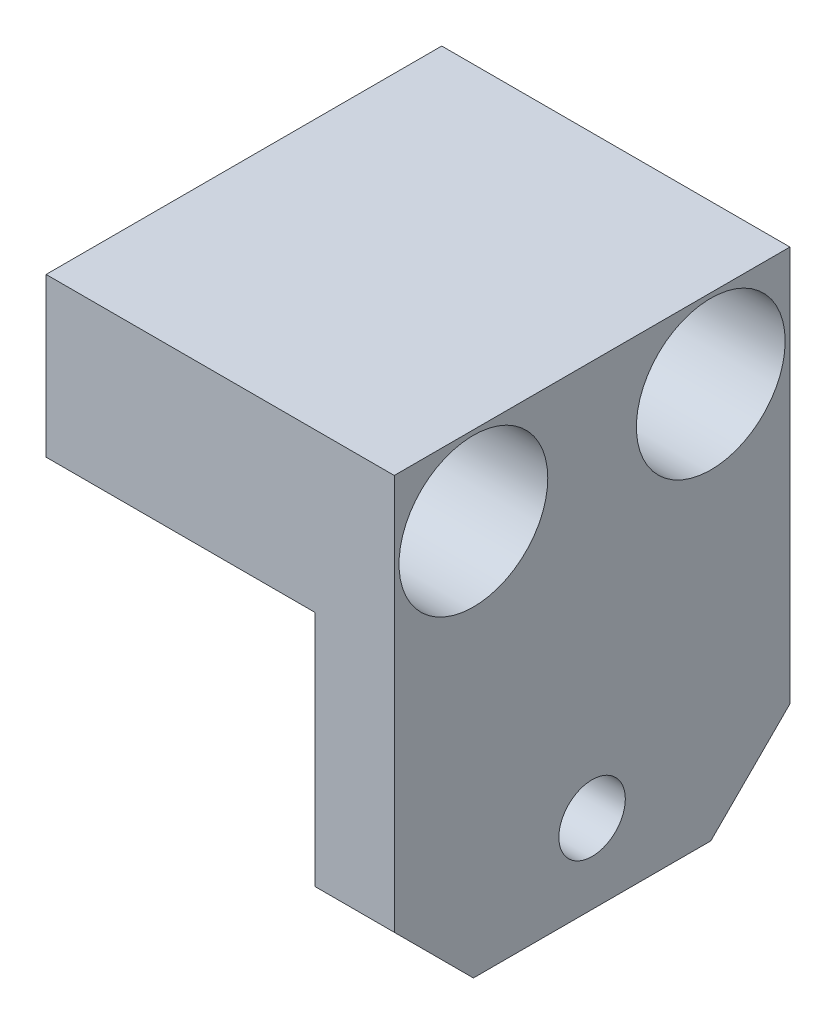
ISO-10303-21;
HEADER;
FILE_DESCRIPTION(('STEP AP214'),'2;1');
FILE_NAME('part.step','',(''),(''),'','','');
FILE_SCHEMA(('AUTOMOTIVE_DESIGN { 1 0 10303 214 1 1 1 1 }'));
ENDSEC;
DATA;
#1=APPLICATION_CONTEXT('core data for automotive mechanical design processes');
#2=APPLICATION_PROTOCOL_DEFINITION('international standard','automotive_design',2000,#1);
#3=PRODUCT_CONTEXT('',#1,'mechanical');
#4=PRODUCT('Part','Part','',(#3));
#5=PRODUCT_RELATED_PRODUCT_CATEGORY('part','',(#4));
#6=PRODUCT_DEFINITION_FORMATION('','',#4);
#7=PRODUCT_DEFINITION_CONTEXT('part definition',#1,'design');
#8=PRODUCT_DEFINITION('design','',#6,#7);
#9=PRODUCT_DEFINITION_SHAPE('','',#8);
#10=(LENGTH_UNIT() NAMED_UNIT(*) SI_UNIT(.MILLI.,.METRE.));
#11=(NAMED_UNIT(*) PLANE_ANGLE_UNIT() SI_UNIT($,.RADIAN.));
#12=(NAMED_UNIT(*) SI_UNIT($,.STERADIAN.) SOLID_ANGLE_UNIT());
#13=UNCERTAINTY_MEASURE_WITH_UNIT(LENGTH_MEASURE(1.E-05),#10,'distance_accuracy_value','');
#14=(GEOMETRIC_REPRESENTATION_CONTEXT(3) GLOBAL_UNCERTAINTY_ASSIGNED_CONTEXT((#13)) GLOBAL_UNIT_ASSIGNED_CONTEXT((#10,
#11,#12)) REPRESENTATION_CONTEXT('',''));
#15=CARTESIAN_POINT('',(0.,0.,0.));
#16=DIRECTION('',(0.,0.,1.));
#17=DIRECTION('',(1.,0.,0.));
#18=AXIS2_PLACEMENT_3D('',#15,#16,#17);
#19=CARTESIAN_POINT('',(11.,-15.,12.5));
#20=DIRECTION('',(-1.,0.,0.));
#21=DIRECTION('',(0.,0.,1.));
#22=AXIS2_PLACEMENT_3D('',#19,#20,#21);
#23=PLANE('',#22);
#24=CARTESIAN_POINT('',(11.,-10.,0.));
#25=DIRECTION('',(1.,0.,0.));
#26=DIRECTION('',(0.,0.,-1.));
#27=AXIS2_PLACEMENT_3D('',#24,#25,#26);
#28=CIRCLE('',#27,2.09999999999999);
#29=CARTESIAN_POINT('',(11.,-10.,-2.09999999999999));
#30=VERTEX_POINT('',#29);
#31=EDGE_CURVE('E151',#30,#30,#28,.T.);
#32=ORIENTED_EDGE('',*,*,#31,.F.);
#33=EDGE_LOOP('',(#32));
#34=FACE_BOUND('',#33,.T.);
#35=CARTESIAN_POINT('',(11.,9.99999999999999,-7.5));
#36=DIRECTION('',(1.,0.,0.));
#37=DIRECTION('',(0.,0.,-1.));
#38=AXIS2_PLACEMENT_3D('',#35,#36,#37);
#39=CIRCLE('',#38,4.7);
#40=CARTESIAN_POINT('',(11.,9.99999999999999,-12.2));
#41=VERTEX_POINT('',#40);
#42=EDGE_CURVE('E150',#41,#41,#39,.T.);
#43=ORIENTED_EDGE('',*,*,#42,.F.);
#44=EDGE_LOOP('',(#43));
#45=FACE_BOUND('',#44,.T.);
#46=CARTESIAN_POINT('',(11.,9.99999999999999,7.5));
#47=DIRECTION('',(1.,0.,0.));
#48=DIRECTION('',(0.,0.,-1.));
#49=AXIS2_PLACEMENT_3D('',#46,#47,#48);
#50=CIRCLE('',#49,4.7);
#51=CARTESIAN_POINT('',(11.,9.99999999999999,2.8));
#52=VERTEX_POINT('',#51);
#53=EDGE_CURVE('E191',#52,#52,#50,.T.);
#54=ORIENTED_EDGE('',*,*,#53,.F.);
#55=EDGE_LOOP('',(#54));
#56=FACE_BOUND('',#55,.T.);
#57=DIRECTION('',(0.,0.,-1.));
#58=VECTOR('',#57,1.);
#59=CARTESIAN_POINT('',(11.,-15.,12.5));
#60=LINE('',#59,#58);
#61=CARTESIAN_POINT('',(11.,-15.,7.49999999999999));
#62=VERTEX_POINT('',#61);
#63=CARTESIAN_POINT('',(11.,-15.,-7.5));
#64=VERTEX_POINT('',#63);
#65=EDGE_CURVE('E138',#62,#64,#60,.T.);
#66=ORIENTED_EDGE('',*,*,#65,.T.);
#67=DIRECTION('',(0.,0.707106781186549,-0.707106781186547));
#68=VECTOR('',#67,1.);
#69=CARTESIAN_POINT('',(11.,-15.,-7.5));
#70=LINE('',#69,#68);
#71=CARTESIAN_POINT('',(11.,-9.99999999999999,-12.5));
#72=VERTEX_POINT('',#71);
#73=EDGE_CURVE('E158',#64,#72,#70,.T.);
#74=ORIENTED_EDGE('',*,*,#73,.T.);
#75=DIRECTION('',(0.,1.,0.));
#76=VECTOR('',#75,1.);
#77=CARTESIAN_POINT('',(11.,-15.,-12.5));
#78=LINE('',#77,#76);
#79=CARTESIAN_POINT('',(11.,15.,-12.5));
#80=VERTEX_POINT('',#79);
#81=EDGE_CURVE('E116',#72,#80,#78,.T.);
#82=ORIENTED_EDGE('',*,*,#81,.T.);
#83=DIRECTION('',(0.,0.,-1.));
#84=VECTOR('',#83,1.);
#85=CARTESIAN_POINT('',(11.,15.,12.5));
#86=LINE('',#85,#84);
#87=CARTESIAN_POINT('',(11.,15.,12.5));
#88=VERTEX_POINT('',#87);
#89=EDGE_CURVE('E143',#88,#80,#86,.T.);
#90=ORIENTED_EDGE('',*,*,#89,.F.);
#91=DIRECTION('',(0.,1.,0.));
#92=VECTOR('',#91,1.);
#93=CARTESIAN_POINT('',(11.,-15.,12.5));
#94=LINE('',#93,#92);
#95=CARTESIAN_POINT('',(11.,-10.,12.5));
#96=VERTEX_POINT('',#95);
#97=EDGE_CURVE('E130',#96,#88,#94,.T.);
#98=ORIENTED_EDGE('',*,*,#97,.F.);
#99=DIRECTION('',(0.,0.707106781186547,0.707106781186549));
#100=VECTOR('',#99,1.);
#101=CARTESIAN_POINT('',(11.,-10.,12.5));
#102=LINE('',#101,#100);
#103=EDGE_CURVE('E156',#96,#62,#102,.F.);
#104=ORIENTED_EDGE('',*,*,#103,.T.);
#105=EDGE_LOOP('',(#66,#74,#82,#90,#98,#104));
#106=FACE_BOUND('',#105,.T.);
#107=ADVANCED_FACE('F37',(#34,#45,#56,#106),#23,.F.);
#108=CARTESIAN_POINT('',(-11.,15.,12.5));
#109=DIRECTION('',(0.,-1.,0.));
#110=DIRECTION('',(0.,0.,-1.));
#111=AXIS2_PLACEMENT_3D('',#108,#109,#110);
#112=PLANE('',#111);
#113=DIRECTION('',(-1.,0.,0.));
#114=VECTOR('',#113,1.);
#115=CARTESIAN_POINT('',(-11.,15.,-12.5));
#116=LINE('',#115,#114);
#117=CARTESIAN_POINT('',(-11.,15.,-12.5));
#118=VERTEX_POINT('',#117);
#119=EDGE_CURVE('E131',#80,#118,#116,.T.);
#120=ORIENTED_EDGE('',*,*,#119,.T.);
#121=DIRECTION('',(0.,0.,-1.));
#122=VECTOR('',#121,1.);
#123=CARTESIAN_POINT('',(-11.,15.,12.5));
#124=LINE('',#123,#122);
#125=CARTESIAN_POINT('',(-11.,15.,12.5));
#126=VERTEX_POINT('',#125);
#127=EDGE_CURVE('E129',#126,#118,#124,.T.);
#128=ORIENTED_EDGE('',*,*,#127,.F.);
#129=DIRECTION('',(-1.,0.,0.));
#130=VECTOR('',#129,1.);
#131=CARTESIAN_POINT('',(-11.,15.,12.5));
#132=LINE('',#131,#130);
#133=EDGE_CURVE('E133',#88,#126,#132,.T.);
#134=ORIENTED_EDGE('',*,*,#133,.F.);
#135=ORIENTED_EDGE('',*,*,#89,.T.);
#136=EDGE_LOOP('',(#120,#128,#134,#135));
#137=FACE_BOUND('',#136,.T.);
#138=ADVANCED_FACE('F213',(#137),#112,.F.);
#139=CARTESIAN_POINT('',(-11.,-15.,12.5));
#140=DIRECTION('',(1.,0.,0.));
#141=DIRECTION('',(0.,0.,-1.));
#142=AXIS2_PLACEMENT_3D('',#139,#140,#141);
#143=PLANE('',#142);
#144=CARTESIAN_POINT('',(-11.,9.99999999999999,-7.5));
#145=DIRECTION('',(1.,0.,0.));
#146=DIRECTION('',(0.,0.,-1.));
#147=AXIS2_PLACEMENT_3D('',#144,#145,#146);
#148=CIRCLE('',#147,2.74999999999999);
#149=CARTESIAN_POINT('',(-11.,9.99999999999999,-10.25));
#150=VERTEX_POINT('',#149);
#151=EDGE_CURVE('E194',#150,#150,#148,.T.);
#152=ORIENTED_EDGE('',*,*,#151,.T.);
#153=EDGE_LOOP('',(#152));
#154=FACE_BOUND('',#153,.T.);
#155=CARTESIAN_POINT('',(-11.,9.99999999999999,7.5));
#156=DIRECTION('',(1.,0.,0.));
#157=DIRECTION('',(0.,0.,-1.));
#158=AXIS2_PLACEMENT_3D('',#155,#156,#157);
#159=CIRCLE('',#158,2.74999999999999);
#160=CARTESIAN_POINT('',(-11.,9.99999999999999,4.75000000000001));
#161=VERTEX_POINT('',#160);
#162=EDGE_CURVE('E180',#161,#161,#159,.T.);
#163=ORIENTED_EDGE('',*,*,#162,.T.);
#164=EDGE_LOOP('',(#163));
#165=FACE_BOUND('',#164,.T.);
#166=DIRECTION('',(0.,-1.,0.));
#167=VECTOR('',#166,1.);
#168=CARTESIAN_POINT('',(-11.,-15.,-12.5));
#169=LINE('',#168,#167);
#170=CARTESIAN_POINT('',(-11.,5.,-12.5));
#171=VERTEX_POINT('',#170);
#172=EDGE_CURVE('E122',#118,#171,#169,.T.);
#173=ORIENTED_EDGE('',*,*,#172,.T.);
#174=DIRECTION('',(0.,0.,1.));
#175=VECTOR('',#174,1.);
#176=CARTESIAN_POINT('',(-11.,5.,-12.5));
#177=LINE('',#176,#175);
#178=CARTESIAN_POINT('',(-11.,5.,12.5));
#179=VERTEX_POINT('',#178);
#180=EDGE_CURVE('E104',#171,#179,#177,.T.);
#181=ORIENTED_EDGE('',*,*,#180,.T.);
#182=DIRECTION('',(0.,-1.,0.));
#183=VECTOR('',#182,1.);
#184=CARTESIAN_POINT('',(-11.,-15.,12.5));
#185=LINE('',#184,#183);
#186=EDGE_CURVE('E141',#126,#179,#185,.T.);
#187=ORIENTED_EDGE('',*,*,#186,.F.);
#188=ORIENTED_EDGE('',*,*,#127,.T.);
#189=EDGE_LOOP('',(#173,#181,#187,#188));
#190=FACE_BOUND('',#189,.T.);
#191=ADVANCED_FACE('F127',(#154,#165,#190),#143,.F.);
#192=CARTESIAN_POINT('',(-11.,-15.,12.5));
#193=DIRECTION('',(0.,1.,0.));
#194=DIRECTION('',(0.,0.,1.));
#195=AXIS2_PLACEMENT_3D('',#192,#193,#194);
#196=PLANE('',#195);
#197=DIRECTION('',(0.,0.,1.));
#198=VECTOR('',#197,1.);
#199=CARTESIAN_POINT('',(6.,-15.,-12.5));
#200=LINE('',#199,#198);
#201=CARTESIAN_POINT('',(6.,-15.,-7.50000000000001));
#202=VERTEX_POINT('',#201);
#203=CARTESIAN_POINT('',(6.,-15.,7.49999999999998));
#204=VERTEX_POINT('',#203);
#205=EDGE_CURVE('E124',#202,#204,#200,.T.);
#206=ORIENTED_EDGE('',*,*,#205,.F.);
#207=DIRECTION('',(1.,0.,0.));
#208=VECTOR('',#207,1.);
#209=CARTESIAN_POINT('',(11.,-15.,-7.5));
#210=LINE('',#209,#208);
#211=EDGE_CURVE('E153',#202,#64,#210,.T.);
#212=ORIENTED_EDGE('',*,*,#211,.T.);
#213=ORIENTED_EDGE('',*,*,#65,.F.);
#214=DIRECTION('',(-1.,0.,0.));
#215=VECTOR('',#214,1.);
#216=CARTESIAN_POINT('',(-11.,-15.,7.49999999999999));
#217=LINE('',#216,#215);
#218=EDGE_CURVE('E146',#62,#204,#217,.T.);
#219=ORIENTED_EDGE('',*,*,#218,.T.);
#220=EDGE_LOOP('',(#206,#212,#213,#219));
#221=FACE_BOUND('',#220,.T.);
#222=ADVANCED_FACE('F167',(#221),#196,.F.);
#223=CARTESIAN_POINT('',(0.,0.,12.5));
#224=DIRECTION('',(0.,0.,-1.));
#225=DIRECTION('',(-1.,0.,0.));
#226=AXIS2_PLACEMENT_3D('',#223,#224,#225);
#227=PLANE('',#226);
#228=DIRECTION('',(0.,1.,0.));
#229=VECTOR('',#228,1.);
#230=CARTESIAN_POINT('',(6.,-15.,12.5));
#231=LINE('',#230,#229);
#232=CARTESIAN_POINT('',(6.,-10.,12.5));
#233=VERTEX_POINT('',#232);
#234=CARTESIAN_POINT('',(6.,4.99999999999999,12.5));
#235=VERTEX_POINT('',#234);
#236=EDGE_CURVE('E179',#233,#235,#231,.T.);
#237=ORIENTED_EDGE('',*,*,#236,.F.);
#238=DIRECTION('',(1.,0.,0.));
#239=VECTOR('',#238,1.);
#240=CARTESIAN_POINT('',(0.,-10.,12.5));
#241=LINE('',#240,#239);
#242=EDGE_CURVE('E11',#233,#96,#241,.T.);
#243=ORIENTED_EDGE('',*,*,#242,.T.);
#244=ORIENTED_EDGE('',*,*,#97,.T.);
#245=ORIENTED_EDGE('',*,*,#133,.T.);
#246=ORIENTED_EDGE('',*,*,#186,.T.);
#247=DIRECTION('',(-1.,0.,0.));
#248=VECTOR('',#247,1.);
#249=CARTESIAN_POINT('',(-11.,5.,12.5));
#250=LINE('',#249,#248);
#251=EDGE_CURVE('E111',#235,#179,#250,.T.);
#252=ORIENTED_EDGE('',*,*,#251,.F.);
#253=EDGE_LOOP('',(#237,#243,#244,#245,#246,#252));
#254=FACE_BOUND('',#253,.T.);
#255=ADVANCED_FACE('F246',(#254),#227,.F.);
#256=CARTESIAN_POINT('',(0.,0.,-12.5));
#257=DIRECTION('',(0.,0.,-1.));
#258=DIRECTION('',(-1.,0.,0.));
#259=AXIS2_PLACEMENT_3D('',#256,#257,#258);
#260=PLANE('',#259);
#261=ORIENTED_EDGE('',*,*,#81,.F.);
#262=DIRECTION('',(-1.,0.,0.));
#263=VECTOR('',#262,1.);
#264=CARTESIAN_POINT('',(6.,-9.99999999999999,-12.5));
#265=LINE('',#264,#263);
#266=CARTESIAN_POINT('',(6.,-9.99999999999999,-12.5));
#267=VERTEX_POINT('',#266);
#268=EDGE_CURVE('E60',#72,#267,#265,.T.);
#269=ORIENTED_EDGE('',*,*,#268,.T.);
#270=DIRECTION('',(0.,1.,0.));
#271=VECTOR('',#270,1.);
#272=CARTESIAN_POINT('',(6.,-15.,-12.5));
#273=LINE('',#272,#271);
#274=CARTESIAN_POINT('',(6.,4.99999999999999,-12.5));
#275=VERTEX_POINT('',#274);
#276=EDGE_CURVE('E123',#267,#275,#273,.T.);
#277=ORIENTED_EDGE('',*,*,#276,.T.);
#278=DIRECTION('',(-1.,0.,0.));
#279=VECTOR('',#278,1.);
#280=CARTESIAN_POINT('',(-11.,5.,-12.5));
#281=LINE('',#280,#279);
#282=EDGE_CURVE('E108',#275,#171,#281,.T.);
#283=ORIENTED_EDGE('',*,*,#282,.T.);
#284=ORIENTED_EDGE('',*,*,#172,.F.);
#285=ORIENTED_EDGE('',*,*,#119,.F.);
#286=EDGE_LOOP('',(#261,#269,#277,#283,#284,#285));
#287=FACE_BOUND('',#286,.T.);
#288=ADVANCED_FACE('F120',(#287),#260,.T.);
#289=CARTESIAN_POINT('',(-11.,5.,-12.5));
#290=DIRECTION('',(0.,1.,0.));
#291=DIRECTION('',(-1.,0.,0.));
#292=AXIS2_PLACEMENT_3D('',#289,#290,#291);
#293=PLANE('',#292);
#294=ORIENTED_EDGE('',*,*,#251,.T.);
#295=ORIENTED_EDGE('',*,*,#180,.F.);
#296=ORIENTED_EDGE('',*,*,#282,.F.);
#297=DIRECTION('',(0.,0.,1.));
#298=VECTOR('',#297,1.);
#299=CARTESIAN_POINT('',(6.,4.99999999999999,-12.5));
#300=LINE('',#299,#298);
#301=EDGE_CURVE('E117',#275,#235,#300,.T.);
#302=ORIENTED_EDGE('',*,*,#301,.T.);
#303=EDGE_LOOP('',(#294,#295,#296,#302));
#304=FACE_BOUND('',#303,.T.);
#305=ADVANCED_FACE('F106',(#304),#293,.F.);
#306=CARTESIAN_POINT('',(6.,-15.,-12.5));
#307=DIRECTION('',(1.,0.,0.));
#308=DIRECTION('',(0.,0.,-1.));
#309=AXIS2_PLACEMENT_3D('',#306,#307,#308);
#310=PLANE('',#309);
#311=CARTESIAN_POINT('',(6.,-10.,0.));
#312=DIRECTION('',(1.,0.,0.));
#313=DIRECTION('',(0.,0.,-1.));
#314=AXIS2_PLACEMENT_3D('',#311,#312,#313);
#315=CIRCLE('',#314,2.09999999999999);
#316=CARTESIAN_POINT('',(6.,-10.,-2.09999999999999));
#317=VERTEX_POINT('',#316);
#318=EDGE_CURVE('E147',#317,#317,#315,.T.);
#319=ORIENTED_EDGE('',*,*,#318,.T.);
#320=EDGE_LOOP('',(#319));
#321=FACE_BOUND('',#320,.T.);
#322=ORIENTED_EDGE('',*,*,#276,.F.);
#323=DIRECTION('',(0.,-0.707106781186549,0.707106781186547));
#324=VECTOR('',#323,1.);
#325=CARTESIAN_POINT('',(6.,-15.,-7.5));
#326=LINE('',#325,#324);
#327=EDGE_CURVE('E45',#267,#202,#326,.T.);
#328=ORIENTED_EDGE('',*,*,#327,.T.);
#329=ORIENTED_EDGE('',*,*,#205,.T.);
#330=DIRECTION('',(0.,-0.707106781186547,-0.707106781186549));
#331=VECTOR('',#330,1.);
#332=CARTESIAN_POINT('',(6.,-10.,12.5));
#333=LINE('',#332,#331);
#334=EDGE_CURVE('E52',#204,#233,#333,.F.);
#335=ORIENTED_EDGE('',*,*,#334,.T.);
#336=ORIENTED_EDGE('',*,*,#236,.T.);
#337=ORIENTED_EDGE('',*,*,#301,.F.);
#338=EDGE_LOOP('',(#322,#328,#329,#335,#336,#337));
#339=FACE_BOUND('',#338,.T.);
#340=ADVANCED_FACE('F163',(#321,#339),#310,.F.);
#341=CARTESIAN_POINT('',(11.,9.99999999999999,7.5));
#342=DIRECTION('',(1.,0.,0.));
#343=DIRECTION('',(0.,0.,-1.));
#344=AXIS2_PLACEMENT_3D('',#341,#342,#343);
#345=CYLINDRICAL_SURFACE('',#344,2.75);
#346=ORIENTED_EDGE('',*,*,#162,.F.);
#347=EDGE_LOOP('',(#346));
#348=FACE_BOUND('',#347,.T.);
#349=CARTESIAN_POINT('',(4.,9.99999999999999,7.5));
#350=DIRECTION('',(1.,0.,0.));
#351=DIRECTION('',(0.,0.,-1.));
#352=AXIS2_PLACEMENT_3D('',#349,#350,#351);
#353=CIRCLE('',#352,2.75);
#354=CARTESIAN_POINT('',(4.,9.99999999999999,4.75));
#355=VERTEX_POINT('',#354);
#356=EDGE_CURVE('E185',#355,#355,#353,.T.);
#357=ORIENTED_EDGE('',*,*,#356,.T.);
#358=EDGE_LOOP('',(#357));
#359=FACE_BOUND('',#358,.T.);
#360=ADVANCED_FACE('F232',(#348,#359),#345,.F.);
#361=CARTESIAN_POINT('',(4.,12.75,7.5));
#362=DIRECTION('',(-1.,0.,0.));
#363=DIRECTION('',(0.,0.,1.));
#364=AXIS2_PLACEMENT_3D('',#361,#362,#363);
#365=PLANE('',#364);
#366=ORIENTED_EDGE('',*,*,#356,.F.);
#367=EDGE_LOOP('',(#366));
#368=FACE_BOUND('',#367,.T.);
#369=CARTESIAN_POINT('',(4.,9.99999999999999,7.5));
#370=DIRECTION('',(1.,0.,0.));
#371=DIRECTION('',(0.,0.,-1.));
#372=AXIS2_PLACEMENT_3D('',#369,#370,#371);
#373=CIRCLE('',#372,4.7);
#374=CARTESIAN_POINT('',(4.,9.99999999999999,2.8));
#375=VERTEX_POINT('',#374);
#376=EDGE_CURVE('E188',#375,#375,#373,.T.);
#377=ORIENTED_EDGE('',*,*,#376,.T.);
#378=EDGE_LOOP('',(#377));
#379=FACE_BOUND('',#378,.T.);
#380=ADVANCED_FACE('F222',(#368,#379),#365,.F.);
#381=CARTESIAN_POINT('',(11.,9.99999999999999,7.5));
#382=DIRECTION('',(1.,0.,0.));
#383=DIRECTION('',(0.,0.,-1.));
#384=AXIS2_PLACEMENT_3D('',#381,#382,#383);
#385=CYLINDRICAL_SURFACE('',#384,4.7);
#386=ORIENTED_EDGE('',*,*,#376,.F.);
#387=EDGE_LOOP('',(#386));
#388=FACE_BOUND('',#387,.T.);
#389=ORIENTED_EDGE('',*,*,#53,.T.);
#390=EDGE_LOOP('',(#389));
#391=FACE_BOUND('',#390,.T.);
#392=ADVANCED_FACE('F219',(#388,#391),#385,.F.);
#393=CARTESIAN_POINT('',(11.,9.99999999999999,-7.5));
#394=DIRECTION('',(1.,0.,0.));
#395=DIRECTION('',(0.,0.,-1.));
#396=AXIS2_PLACEMENT_3D('',#393,#394,#395);
#397=CYLINDRICAL_SURFACE('',#396,2.75);
#398=ORIENTED_EDGE('',*,*,#151,.F.);
#399=EDGE_LOOP('',(#398));
#400=FACE_BOUND('',#399,.T.);
#401=CARTESIAN_POINT('',(4.,9.99999999999999,-7.5));
#402=DIRECTION('',(1.,0.,0.));
#403=DIRECTION('',(0.,0.,-1.));
#404=AXIS2_PLACEMENT_3D('',#401,#402,#403);
#405=CIRCLE('',#404,2.75);
#406=CARTESIAN_POINT('',(4.,9.99999999999999,-10.25));
#407=VERTEX_POINT('',#406);
#408=EDGE_CURVE('E197',#407,#407,#405,.T.);
#409=ORIENTED_EDGE('',*,*,#408,.T.);
#410=EDGE_LOOP('',(#409));
#411=FACE_BOUND('',#410,.T.);
#412=ADVANCED_FACE('F221',(#400,#411),#397,.F.);
#413=CARTESIAN_POINT('',(4.,12.75,-7.5));
#414=DIRECTION('',(-1.,0.,0.));
#415=DIRECTION('',(0.,0.,1.));
#416=AXIS2_PLACEMENT_3D('',#413,#414,#415);
#417=PLANE('',#416);
#418=ORIENTED_EDGE('',*,*,#408,.F.);
#419=EDGE_LOOP('',(#418));
#420=FACE_BOUND('',#419,.T.);
#421=CARTESIAN_POINT('',(4.,9.99999999999999,-7.5));
#422=DIRECTION('',(1.,0.,0.));
#423=DIRECTION('',(0.,0.,-1.));
#424=AXIS2_PLACEMENT_3D('',#421,#422,#423);
#425=CIRCLE('',#424,4.7);
#426=CARTESIAN_POINT('',(4.,9.99999999999999,-12.2));
#427=VERTEX_POINT('',#426);
#428=EDGE_CURVE('E200',#427,#427,#425,.T.);
#429=ORIENTED_EDGE('',*,*,#428,.T.);
#430=EDGE_LOOP('',(#429));
#431=FACE_BOUND('',#430,.T.);
#432=ADVANCED_FACE('F229',(#420,#431),#417,.F.);
#433=CARTESIAN_POINT('',(11.,9.99999999999999,-7.5));
#434=DIRECTION('',(1.,0.,0.));
#435=DIRECTION('',(0.,0.,-1.));
#436=AXIS2_PLACEMENT_3D('',#433,#434,#435);
#437=CYLINDRICAL_SURFACE('',#436,4.7);
#438=ORIENTED_EDGE('',*,*,#428,.F.);
#439=EDGE_LOOP('',(#438));
#440=FACE_BOUND('',#439,.T.);
#441=ORIENTED_EDGE('',*,*,#42,.T.);
#442=EDGE_LOOP('',(#441));
#443=FACE_BOUND('',#442,.T.);
#444=ADVANCED_FACE('F265',(#440,#443),#437,.F.);
#445=CARTESIAN_POINT('',(11.,-10.,0.));
#446=DIRECTION('',(1.,0.,0.));
#447=DIRECTION('',(0.,0.,-1.));
#448=AXIS2_PLACEMENT_3D('',#445,#446,#447);
#449=CYLINDRICAL_SURFACE('',#448,2.09999999999999);
#450=ORIENTED_EDGE('',*,*,#31,.T.);
#451=EDGE_LOOP('',(#450));
#452=FACE_BOUND('',#451,.T.);
#453=ORIENTED_EDGE('',*,*,#318,.F.);
#454=EDGE_LOOP('',(#453));
#455=FACE_BOUND('',#454,.T.);
#456=ADVANCED_FACE('F208',(#452,#455),#449,.F.);
#457=CARTESIAN_POINT('',(-11.,-15.,-7.5));
#458=DIRECTION('',(0.,-0.707106781186546,-0.707106781186548));
#459=DIRECTION('',(-1.,0.,0.));
#460=AXIS2_PLACEMENT_3D('',#457,#458,#459);
#461=PLANE('',#460);
#462=ORIENTED_EDGE('',*,*,#327,.F.);
#463=ORIENTED_EDGE('',*,*,#268,.F.);
#464=ORIENTED_EDGE('',*,*,#73,.F.);
#465=ORIENTED_EDGE('',*,*,#211,.F.);
#466=EDGE_LOOP('',(#462,#463,#464,#465));
#467=FACE_BOUND('',#466,.T.);
#468=ADVANCED_FACE('F171',(#467),#461,.T.);
#469=CARTESIAN_POINT('',(0.,-10.,12.5));
#470=DIRECTION('',(0.,0.707106781186548,-0.707106781186546));
#471=DIRECTION('',(1.,0.,0.));
#472=AXIS2_PLACEMENT_3D('',#469,#470,#471);
#473=PLANE('',#472);
#474=ORIENTED_EDGE('',*,*,#334,.F.);
#475=ORIENTED_EDGE('',*,*,#218,.F.);
#476=ORIENTED_EDGE('',*,*,#103,.F.);
#477=ORIENTED_EDGE('',*,*,#242,.F.);
#478=EDGE_LOOP('',(#474,#475,#476,#477));
#479=FACE_BOUND('',#478,.T.);
#480=ADVANCED_FACE('F39',(#479),#473,.F.);
#481=CLOSED_SHELL('',(#107,#138,#191,#222,#255,#288,#305,#340,#360,#380,#392,#412,#432,#444,
#456,#468,#480));
#482=MANIFOLD_SOLID_BREP('B2',#481);
#483=ADVANCED_BREP_SHAPE_REPRESENTATION('',(#18,#482),#14);
#484=SHAPE_DEFINITION_REPRESENTATION(#9,#483);
ENDSEC;
END-ISO-10303-21;
